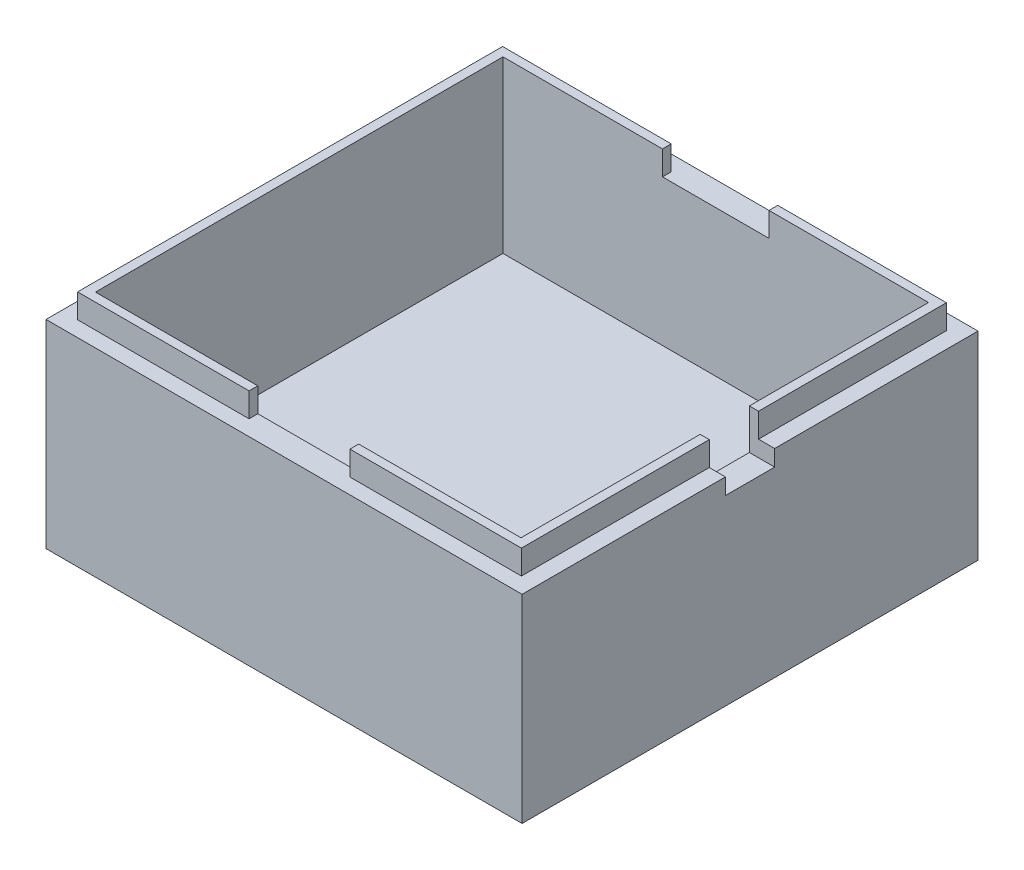
ISO-10303-21;
HEADER;
FILE_DESCRIPTION(('STEP AP214'),'2;1');
FILE_NAME('part.step','',(''),(''),'','','');
FILE_SCHEMA(('AUTOMOTIVE_DESIGN { 1 0 10303 214 1 1 1 1 }'));
ENDSEC;
DATA;
#1=APPLICATION_CONTEXT('core data for automotive mechanical design processes');
#2=APPLICATION_PROTOCOL_DEFINITION('international standard','automotive_design',2000,#1);
#3=PRODUCT_CONTEXT('',#1,'mechanical');
#4=PRODUCT('Part','Part','',(#3));
#5=PRODUCT_RELATED_PRODUCT_CATEGORY('part','',(#4));
#6=PRODUCT_DEFINITION_FORMATION('','',#4);
#7=PRODUCT_DEFINITION_CONTEXT('part definition',#1,'design');
#8=PRODUCT_DEFINITION('design','',#6,#7);
#9=PRODUCT_DEFINITION_SHAPE('','',#8);
#10=(LENGTH_UNIT() NAMED_UNIT(*) SI_UNIT(.MILLI.,.METRE.));
#11=(NAMED_UNIT(*) PLANE_ANGLE_UNIT() SI_UNIT($,.RADIAN.));
#12=(NAMED_UNIT(*) SI_UNIT($,.STERADIAN.) SOLID_ANGLE_UNIT());
#13=UNCERTAINTY_MEASURE_WITH_UNIT(LENGTH_MEASURE(1.E-05),#10,'distance_accuracy_value','');
#14=(GEOMETRIC_REPRESENTATION_CONTEXT(3) GLOBAL_UNCERTAINTY_ASSIGNED_CONTEXT((#13)) GLOBAL_UNIT_ASSIGNED_CONTEXT((#10,
#11,#12)) REPRESENTATION_CONTEXT('',''));
#15=CARTESIAN_POINT('',(0.,0.,0.));
#16=DIRECTION('',(0.,0.,1.));
#17=DIRECTION('',(1.,0.,0.));
#18=AXIS2_PLACEMENT_3D('',#15,#16,#17);
#19=CARTESIAN_POINT('',(-22.9999999999999,10.,21.7500000000002));
#20=DIRECTION('',(0.,-1.,0.));
#21=DIRECTION('',(0.,0.,-1.));
#22=AXIS2_PLACEMENT_3D('',#19,#20,#21);
#23=CYLINDRICAL_SURFACE('',#22,1.8526);
#24=CARTESIAN_POINT('',(-22.9999999999999,6.5,21.7500000000002));
#25=DIRECTION('',(0.,-1.,0.));
#26=DIRECTION('',(0.,0.,-1.));
#27=AXIS2_PLACEMENT_3D('',#24,#25,#26);
#28=CIRCLE('',#27,1.8526);
#29=CARTESIAN_POINT('',(-22.9999999999999,6.5,19.8974000000002));
#30=VERTEX_POINT('',#29);
#31=EDGE_CURVE('E478',#30,#30,#28,.T.);
#32=ORIENTED_EDGE('',*,*,#31,.F.);
#33=EDGE_LOOP('',(#32));
#34=FACE_BOUND('',#33,.T.);
#35=CARTESIAN_POINT('',(-22.9999999999999,4.5,21.7500000000002));
#36=DIRECTION('',(0.,-1.,0.));
#37=DIRECTION('',(0.,0.,-1.));
#38=AXIS2_PLACEMENT_3D('',#35,#36,#37);
#39=CIRCLE('',#38,1.8526);
#40=CARTESIAN_POINT('',(-22.9999999999999,4.5,19.8974000000002));
#41=VERTEX_POINT('',#40);
#42=EDGE_CURVE('E43',#41,#41,#39,.F.);
#43=ORIENTED_EDGE('',*,*,#42,.F.);
#44=EDGE_LOOP('',(#43));
#45=FACE_BOUND('',#44,.T.);
#46=ADVANCED_FACE('F39',(#34,#45),#23,.F.);
#47=CARTESIAN_POINT('',(23.,10.,-21.75));
#48=DIRECTION('',(0.,-1.,0.));
#49=DIRECTION('',(0.,0.,-1.));
#50=AXIS2_PLACEMENT_3D('',#47,#48,#49);
#51=CYLINDRICAL_SURFACE('',#50,1.8526);
#52=CARTESIAN_POINT('',(23.,6.5,-21.75));
#53=DIRECTION('',(0.,-1.,0.));
#54=DIRECTION('',(0.,0.,-1.));
#55=AXIS2_PLACEMENT_3D('',#52,#53,#54);
#56=CIRCLE('',#55,1.8526);
#57=CARTESIAN_POINT('',(23.,6.5,-23.6026));
#58=VERTEX_POINT('',#57);
#59=EDGE_CURVE('E251',#58,#58,#56,.T.);
#60=ORIENTED_EDGE('',*,*,#59,.F.);
#61=EDGE_LOOP('',(#60));
#62=FACE_BOUND('',#61,.T.);
#63=CARTESIAN_POINT('',(23.,4.5,-21.75));
#64=DIRECTION('',(0.,-1.,0.));
#65=DIRECTION('',(0.,0.,-1.));
#66=AXIS2_PLACEMENT_3D('',#63,#64,#65);
#67=CIRCLE('',#66,1.8526);
#68=CARTESIAN_POINT('',(23.,4.5,-23.6026));
#69=VERTEX_POINT('',#68);
#70=EDGE_CURVE('E469',#69,#69,#67,.F.);
#71=ORIENTED_EDGE('',*,*,#70,.F.);
#72=EDGE_LOOP('',(#71));
#73=FACE_BOUND('',#72,.T.);
#74=ADVANCED_FACE('F505',(#62,#73),#51,.F.);
#75=CARTESIAN_POINT('',(0.,27.6,0.));
#76=DIRECTION('',(0.,-1.,0.));
#77=DIRECTION('',(0.,0.,-1.));
#78=AXIS2_PLACEMENT_3D('',#75,#76,#77);
#79=PLANE('',#78);
#80=DIRECTION('',(1.,0.,0.));
#81=VECTOR('',#80,1.);
#82=CARTESIAN_POINT('',(-26.3672566371681,27.6,25.25));
#83=LINE('',#82,#81);
#84=CARTESIAN_POINT('',(6.25,27.6,25.25));
#85=VERTEX_POINT('',#84);
#86=CARTESIAN_POINT('',(26.3672566371681,27.6,25.25));
#87=VERTEX_POINT('',#86);
#88=EDGE_CURVE('E401',#85,#87,#83,.T.);
#89=ORIENTED_EDGE('',*,*,#88,.F.);
#90=DIRECTION('',(0.,0.,-1.));
#91=VECTOR('',#90,1.);
#92=CARTESIAN_POINT('',(6.25,27.6,27.4194915254237));
#93=LINE('',#92,#91);
#94=CARTESIAN_POINT('',(6.25,27.6,26.3347457627119));
#95=VERTEX_POINT('',#94);
#96=EDGE_CURVE('E276',#95,#85,#93,.T.);
#97=ORIENTED_EDGE('',*,*,#96,.F.);
#98=DIRECTION('',(1.,0.,0.));
#99=VECTOR('',#98,1.);
#100=CARTESIAN_POINT('',(-27.5,27.6,26.3347457627119));
#101=LINE('',#100,#99);
#102=CARTESIAN_POINT('',(27.5,27.6,26.3347457627119));
#103=VERTEX_POINT('',#102);
#104=EDGE_CURVE('E355',#95,#103,#101,.T.);
#105=ORIENTED_EDGE('',*,*,#104,.T.);
#106=DIRECTION('',(0.,0.,-1.));
#107=VECTOR('',#106,1.);
#108=CARTESIAN_POINT('',(27.5,27.6,26.3347457627119));
#109=LINE('',#108,#107);
#110=CARTESIAN_POINT('',(27.5,27.6,3.05));
#111=VERTEX_POINT('',#110);
#112=EDGE_CURVE('E342',#103,#111,#109,.T.);
#113=ORIENTED_EDGE('',*,*,#112,.T.);
#114=DIRECTION('',(1.,0.,0.));
#115=VECTOR('',#114,1.);
#116=CARTESIAN_POINT('',(25.2345132743363,27.6,3.05));
#117=LINE('',#116,#115);
#118=CARTESIAN_POINT('',(26.3672566371681,27.6,3.05));
#119=VERTEX_POINT('',#118);
#120=EDGE_CURVE('E303',#119,#111,#117,.T.);
#121=ORIENTED_EDGE('',*,*,#120,.F.);
#122=DIRECTION('',(0.,0.,-1.));
#123=VECTOR('',#122,1.);
#124=CARTESIAN_POINT('',(26.3672566371681,27.6,25.25));
#125=LINE('',#124,#123);
#126=EDGE_CURVE('E223',#87,#119,#125,.T.);
#127=ORIENTED_EDGE('',*,*,#126,.F.);
#128=EDGE_LOOP('',(#89,#97,#105,#113,#121,#127));
#129=FACE_BOUND('',#128,.T.);
#130=ADVANCED_FACE('F508',(#129),#79,.F.);
#131=DIRECTION('',(-1.,0.,0.));
#132=VECTOR('',#131,1.);
#133=CARTESIAN_POINT('',(-27.5,27.6,-26.3347457627119));
#134=LINE('',#133,#132);
#135=CARTESIAN_POINT('',(27.5,27.6,-26.3347457627119));
#136=VERTEX_POINT('',#135);
#137=CARTESIAN_POINT('',(6.59999999999999,27.6,-26.3347457627119));
#138=VERTEX_POINT('',#137);
#139=EDGE_CURVE('E347',#136,#138,#134,.T.);
#140=ORIENTED_EDGE('',*,*,#139,.T.);
#141=DIRECTION('',(0.,0.,-1.));
#142=VECTOR('',#141,1.);
#143=CARTESIAN_POINT('',(6.59999999999999,27.6,-24.4194915254237));
#144=LINE('',#143,#142);
#145=CARTESIAN_POINT('',(6.59999999999999,27.6,-25.25));
#146=VERTEX_POINT('',#145);
#147=EDGE_CURVE('E295',#146,#138,#144,.T.);
#148=ORIENTED_EDGE('',*,*,#147,.F.);
#149=DIRECTION('',(-1.,0.,0.));
#150=VECTOR('',#149,1.);
#151=CARTESIAN_POINT('',(-26.3672566371681,27.6,-25.25));
#152=LINE('',#151,#150);
#153=CARTESIAN_POINT('',(26.3672566371681,27.6,-25.25));
#154=VERTEX_POINT('',#153);
#155=EDGE_CURVE('E393',#154,#146,#152,.T.);
#156=ORIENTED_EDGE('',*,*,#155,.F.);
#157=CARTESIAN_POINT('',(26.3672566371681,27.6,-3.05));
#158=VERTEX_POINT('',#157);
#159=EDGE_CURVE('E392',#158,#154,#125,.T.);
#160=ORIENTED_EDGE('',*,*,#159,.F.);
#161=DIRECTION('',(-1.,0.,0.));
#162=VECTOR('',#161,1.);
#163=CARTESIAN_POINT('',(25.2345132743363,27.6,-3.05));
#164=LINE('',#163,#162);
#165=CARTESIAN_POINT('',(27.5,27.6,-3.05));
#166=VERTEX_POINT('',#165);
#167=EDGE_CURVE('E263',#166,#158,#164,.T.);
#168=ORIENTED_EDGE('',*,*,#167,.F.);
#169=EDGE_CURVE('E227',#166,#136,#109,.T.);
#170=ORIENTED_EDGE('',*,*,#169,.T.);
#171=EDGE_LOOP('',(#140,#148,#156,#160,#168,#170));
#172=FACE_BOUND('',#171,.T.);
#173=ADVANCED_FACE('F514',(#172),#79,.F.);
#174=CARTESIAN_POINT('',(27.5,24.6,26.3347457627119));
#175=DIRECTION('',(1.,0.,0.));
#176=DIRECTION('',(0.,0.,-1.));
#177=AXIS2_PLACEMENT_3D('',#174,#175,#176);
#178=PLANE('',#177);
#179=DIRECTION('',(0.,1.,0.));
#180=VECTOR('',#179,1.);
#181=CARTESIAN_POINT('',(27.5,24.6,3.05));
#182=LINE('',#181,#180);
#183=CARTESIAN_POINT('',(27.5,24.6,3.05));
#184=VERTEX_POINT('',#183);
#185=EDGE_CURVE('E298',#184,#111,#182,.T.);
#186=ORIENTED_EDGE('',*,*,#185,.T.);
#187=ORIENTED_EDGE('',*,*,#112,.F.);
#188=DIRECTION('',(0.,1.,0.));
#189=VECTOR('',#188,1.);
#190=CARTESIAN_POINT('',(27.5,24.6,26.3347457627119));
#191=LINE('',#190,#189);
#192=CARTESIAN_POINT('',(27.5,24.6,26.3347457627119));
#193=VERTEX_POINT('',#192);
#194=EDGE_CURVE('E360',#193,#103,#191,.T.);
#195=ORIENTED_EDGE('',*,*,#194,.F.);
#196=DIRECTION('',(0.,0.,-1.));
#197=VECTOR('',#196,1.);
#198=CARTESIAN_POINT('',(27.5,24.6,26.3347457627119));
#199=LINE('',#198,#197);
#200=EDGE_CURVE('E322',#193,#184,#199,.T.);
#201=ORIENTED_EDGE('',*,*,#200,.T.);
#202=EDGE_LOOP('',(#186,#187,#195,#201));
#203=FACE_BOUND('',#202,.T.);
#204=ADVANCED_FACE('F569',(#203),#178,.T.);
#205=CARTESIAN_POINT('',(-27.5,24.6,26.3347457627119));
#206=DIRECTION('',(0.,0.,1.));
#207=DIRECTION('',(1.,0.,0.));
#208=AXIS2_PLACEMENT_3D('',#205,#206,#207);
#209=PLANE('',#208);
#210=DIRECTION('',(0.,1.,0.));
#211=VECTOR('',#210,1.);
#212=CARTESIAN_POINT('',(6.25,24.6,26.3347457627119));
#213=LINE('',#212,#211);
#214=CARTESIAN_POINT('',(6.25,24.6,26.3347457627119));
#215=VERTEX_POINT('',#214);
#216=EDGE_CURVE('E11',#215,#95,#213,.T.);
#217=ORIENTED_EDGE('',*,*,#216,.F.);
#218=DIRECTION('',(1.,0.,0.));
#219=VECTOR('',#218,1.);
#220=CARTESIAN_POINT('',(-27.5,24.6,26.3347457627119));
#221=LINE('',#220,#219);
#222=EDGE_CURVE('E336',#215,#193,#221,.T.);
#223=ORIENTED_EDGE('',*,*,#222,.T.);
#224=ORIENTED_EDGE('',*,*,#194,.T.);
#225=ORIENTED_EDGE('',*,*,#104,.F.);
#226=EDGE_LOOP('',(#217,#223,#224,#225));
#227=FACE_BOUND('',#226,.T.);
#228=ADVANCED_FACE('F555',(#227),#209,.T.);
#229=CARTESIAN_POINT('',(-27.5,24.6,-26.3347457627119));
#230=DIRECTION('',(0.,0.,-1.));
#231=DIRECTION('',(-1.,0.,0.));
#232=AXIS2_PLACEMENT_3D('',#229,#230,#231);
#233=PLANE('',#232);
#234=DIRECTION('',(0.,-1.,0.));
#235=VECTOR('',#234,1.);
#236=CARTESIAN_POINT('',(6.59999999999999,24.6,-26.3347457627119));
#237=LINE('',#236,#235);
#238=CARTESIAN_POINT('',(6.59999999999999,24.6,-26.3347457627119));
#239=VERTEX_POINT('',#238);
#240=EDGE_CURVE('E465',#138,#239,#237,.T.);
#241=ORIENTED_EDGE('',*,*,#240,.F.);
#242=ORIENTED_EDGE('',*,*,#139,.F.);
#243=DIRECTION('',(0.,1.,0.));
#244=VECTOR('',#243,1.);
#245=CARTESIAN_POINT('',(27.5,24.6,-26.3347457627119));
#246=LINE('',#245,#244);
#247=CARTESIAN_POINT('',(27.5,24.6,-26.3347457627119));
#248=VERTEX_POINT('',#247);
#249=EDGE_CURVE('E341',#248,#136,#246,.T.);
#250=ORIENTED_EDGE('',*,*,#249,.F.);
#251=DIRECTION('',(-1.,0.,0.));
#252=VECTOR('',#251,1.);
#253=CARTESIAN_POINT('',(-27.5,24.6,-26.3347457627119));
#254=LINE('',#253,#252);
#255=EDGE_CURVE('E328',#248,#239,#254,.T.);
#256=ORIENTED_EDGE('',*,*,#255,.T.);
#257=EDGE_LOOP('',(#241,#242,#250,#256));
#258=FACE_BOUND('',#257,.T.);
#259=ADVANCED_FACE('F564',(#258),#233,.T.);
#260=CARTESIAN_POINT('',(-27.5,27.6,26.3347457627119));
#261=VERTEX_POINT('',#260);
#262=CARTESIAN_POINT('',(-6.25,27.6,26.3347457627119));
#263=VERTEX_POINT('',#262);
#264=EDGE_CURVE('E356',#261,#263,#101,.T.);
#265=ORIENTED_EDGE('',*,*,#264,.T.);
#266=DIRECTION('',(0.,0.,1.));
#267=VECTOR('',#266,1.);
#268=CARTESIAN_POINT('',(-6.25,27.6,27.4194915254237));
#269=LINE('',#268,#267);
#270=CARTESIAN_POINT('',(-6.25,27.6,25.25));
#271=VERTEX_POINT('',#270);
#272=EDGE_CURVE('E270',#271,#263,#269,.T.);
#273=ORIENTED_EDGE('',*,*,#272,.F.);
#274=CARTESIAN_POINT('',(-26.3672566371681,27.6,25.25));
#275=VERTEX_POINT('',#274);
#276=EDGE_CURVE('E402',#275,#271,#83,.T.);
#277=ORIENTED_EDGE('',*,*,#276,.F.);
#278=DIRECTION('',(0.,0.,1.));
#279=VECTOR('',#278,1.);
#280=CARTESIAN_POINT('',(-26.3672566371681,27.6,25.25));
#281=LINE('',#280,#279);
#282=CARTESIAN_POINT('',(-26.3672566371681,27.6,-25.25));
#283=VERTEX_POINT('',#282);
#284=EDGE_CURVE('E397',#283,#275,#281,.T.);
#285=ORIENTED_EDGE('',*,*,#284,.F.);
#286=CARTESIAN_POINT('',(-6.60000000000001,27.6,-25.25));
#287=VERTEX_POINT('',#286);
#288=EDGE_CURVE('E391',#287,#283,#152,.T.);
#289=ORIENTED_EDGE('',*,*,#288,.F.);
#290=DIRECTION('',(0.,0.,1.));
#291=VECTOR('',#290,1.);
#292=CARTESIAN_POINT('',(-6.60000000000001,27.6,-24.4194915254237));
#293=LINE('',#292,#291);
#294=CARTESIAN_POINT('',(-6.60000000000001,27.6,-26.3347457627119));
#295=VERTEX_POINT('',#294);
#296=EDGE_CURVE('E291',#295,#287,#293,.T.);
#297=ORIENTED_EDGE('',*,*,#296,.F.);
#298=CARTESIAN_POINT('',(-27.5,27.6,-26.3347457627119));
#299=VERTEX_POINT('',#298);
#300=EDGE_CURVE('E346',#295,#299,#134,.T.);
#301=ORIENTED_EDGE('',*,*,#300,.T.);
#302=DIRECTION('',(0.,0.,1.));
#303=VECTOR('',#302,1.);
#304=CARTESIAN_POINT('',(-27.5,27.6,26.3347457627119));
#305=LINE('',#304,#303);
#306=EDGE_CURVE('E351',#299,#261,#305,.T.);
#307=ORIENTED_EDGE('',*,*,#306,.T.);
#308=EDGE_LOOP('',(#265,#273,#277,#285,#289,#297,#301,#307));
#309=FACE_BOUND('',#308,.T.);
#310=ADVANCED_FACE('F517',(#309),#79,.F.);
#311=CARTESIAN_POINT('',(26.3672566371681,27.6,25.25));
#312=DIRECTION('',(-1.,0.,0.));
#313=DIRECTION('',(0.,0.,1.));
#314=AXIS2_PLACEMENT_3D('',#311,#312,#313);
#315=PLANE('',#314);
#316=DIRECTION('',(0.,0.,1.));
#317=VECTOR('',#316,1.);
#318=CARTESIAN_POINT('',(26.3672566371681,22.6,3.05));
#319=LINE('',#318,#317);
#320=CARTESIAN_POINT('',(26.3672566371681,22.6,-3.05));
#321=VERTEX_POINT('',#320);
#322=CARTESIAN_POINT('',(26.3672566371681,22.6,3.05));
#323=VERTEX_POINT('',#322);
#324=EDGE_CURVE('E220',#321,#323,#319,.T.);
#325=ORIENTED_EDGE('',*,*,#324,.F.);
#326=DIRECTION('',(0.,-1.,0.));
#327=VECTOR('',#326,1.);
#328=CARTESIAN_POINT('',(26.3672566371681,27.6,-3.05));
#329=LINE('',#328,#327);
#330=EDGE_CURVE('E228',#158,#321,#329,.T.);
#331=ORIENTED_EDGE('',*,*,#330,.F.);
#332=ORIENTED_EDGE('',*,*,#159,.T.);
#333=DIRECTION('',(0.,-1.,0.));
#334=VECTOR('',#333,1.);
#335=CARTESIAN_POINT('',(26.3672566371681,27.6,-25.25));
#336=LINE('',#335,#334);
#337=CARTESIAN_POINT('',(26.3672566371681,6.5,-25.25));
#338=VERTEX_POINT('',#337);
#339=EDGE_CURVE('E430',#154,#338,#336,.T.);
#340=ORIENTED_EDGE('',*,*,#339,.T.);
#341=DIRECTION('',(0.,0.,-1.));
#342=VECTOR('',#341,1.);
#343=CARTESIAN_POINT('',(26.3672566371681,6.5,25.25));
#344=LINE('',#343,#342);
#345=CARTESIAN_POINT('',(26.3672566371681,6.5,25.25));
#346=VERTEX_POINT('',#345);
#347=EDGE_CURVE('E388',#346,#338,#344,.T.);
#348=ORIENTED_EDGE('',*,*,#347,.F.);
#349=DIRECTION('',(0.,-1.,0.));
#350=VECTOR('',#349,1.);
#351=CARTESIAN_POINT('',(26.3672566371681,27.6,25.25));
#352=LINE('',#351,#350);
#353=EDGE_CURVE('E406',#87,#346,#352,.T.);
#354=ORIENTED_EDGE('',*,*,#353,.F.);
#355=ORIENTED_EDGE('',*,*,#126,.T.);
#356=DIRECTION('',(0.,1.,0.));
#357=VECTOR('',#356,1.);
#358=CARTESIAN_POINT('',(26.3672566371681,27.6,3.05));
#359=LINE('',#358,#357);
#360=EDGE_CURVE('E215',#323,#119,#359,.T.);
#361=ORIENTED_EDGE('',*,*,#360,.F.);
#362=EDGE_LOOP('',(#325,#331,#332,#340,#348,#354,#355,#361));
#363=FACE_BOUND('',#362,.T.);
#364=ADVANCED_FACE('F217',(#363),#315,.T.);
#365=CARTESIAN_POINT('',(-26.3672566371681,27.6,-25.25));
#366=DIRECTION('',(0.,0.,1.));
#367=DIRECTION('',(1.,0.,0.));
#368=AXIS2_PLACEMENT_3D('',#365,#366,#367);
#369=PLANE('',#368);
#370=DIRECTION('',(0.,1.,0.));
#371=VECTOR('',#370,1.);
#372=CARTESIAN_POINT('',(6.59999999999999,27.6,-25.25));
#373=LINE('',#372,#371);
#374=CARTESIAN_POINT('',(6.59999999999999,24.6,-25.25));
#375=VERTEX_POINT('',#374);
#376=EDGE_CURVE('E317',#375,#146,#373,.T.);
#377=ORIENTED_EDGE('',*,*,#376,.F.);
#378=DIRECTION('',(1.,0.,0.));
#379=VECTOR('',#378,1.);
#380=CARTESIAN_POINT('',(-26.3672566371681,24.6,-25.25));
#381=LINE('',#380,#379);
#382=CARTESIAN_POINT('',(-6.60000000000001,24.6,-25.25));
#383=VERTEX_POINT('',#382);
#384=EDGE_CURVE('E285',#383,#375,#381,.T.);
#385=ORIENTED_EDGE('',*,*,#384,.F.);
#386=DIRECTION('',(0.,-1.,0.));
#387=VECTOR('',#386,1.);
#388=CARTESIAN_POINT('',(-6.60000000000001,27.6,-25.25));
#389=LINE('',#388,#387);
#390=EDGE_CURVE('E314',#287,#383,#389,.T.);
#391=ORIENTED_EDGE('',*,*,#390,.F.);
#392=ORIENTED_EDGE('',*,*,#288,.T.);
#393=DIRECTION('',(0.,-1.,0.));
#394=VECTOR('',#393,1.);
#395=CARTESIAN_POINT('',(-26.3672566371681,27.6,-25.25));
#396=LINE('',#395,#394);
#397=CARTESIAN_POINT('',(-26.3672566371681,6.5,-25.25));
#398=VERTEX_POINT('',#397);
#399=EDGE_CURVE('E427',#283,#398,#396,.T.);
#400=ORIENTED_EDGE('',*,*,#399,.T.);
#401=DIRECTION('',(-1.,0.,0.));
#402=VECTOR('',#401,1.);
#403=CARTESIAN_POINT('',(-26.3672566371681,6.5,-25.25));
#404=LINE('',#403,#402);
#405=EDGE_CURVE('E410',#338,#398,#404,.T.);
#406=ORIENTED_EDGE('',*,*,#405,.F.);
#407=ORIENTED_EDGE('',*,*,#339,.F.);
#408=ORIENTED_EDGE('',*,*,#155,.T.);
#409=EDGE_LOOP('',(#377,#385,#391,#392,#400,#406,#407,#408));
#410=FACE_BOUND('',#409,.T.);
#411=ADVANCED_FACE('F579',(#410),#369,.T.);
#412=CARTESIAN_POINT('',(-26.3672566371681,27.6,25.25));
#413=DIRECTION('',(1.,0.,0.));
#414=DIRECTION('',(0.,0.,-1.));
#415=AXIS2_PLACEMENT_3D('',#412,#413,#414);
#416=PLANE('',#415);
#417=DIRECTION('',(0.,0.,1.));
#418=VECTOR('',#417,1.);
#419=CARTESIAN_POINT('',(-26.3672566371681,6.5,25.25));
#420=LINE('',#419,#418);
#421=CARTESIAN_POINT('',(-26.3672566371681,6.5,25.25));
#422=VERTEX_POINT('',#421);
#423=EDGE_CURVE('E414',#398,#422,#420,.T.);
#424=ORIENTED_EDGE('',*,*,#423,.F.);
#425=ORIENTED_EDGE('',*,*,#399,.F.);
#426=ORIENTED_EDGE('',*,*,#284,.T.);
#427=DIRECTION('',(0.,-1.,0.));
#428=VECTOR('',#427,1.);
#429=CARTESIAN_POINT('',(-26.3672566371681,27.6,25.25));
#430=LINE('',#429,#428);
#431=EDGE_CURVE('E424',#275,#422,#430,.T.);
#432=ORIENTED_EDGE('',*,*,#431,.T.);
#433=EDGE_LOOP('',(#424,#425,#426,#432));
#434=FACE_BOUND('',#433,.T.);
#435=ADVANCED_FACE('F575',(#434),#416,.T.);
#436=CARTESIAN_POINT('',(-26.3672566371681,27.6,25.25));
#437=DIRECTION('',(0.,0.,-1.));
#438=DIRECTION('',(-1.,0.,0.));
#439=AXIS2_PLACEMENT_3D('',#436,#437,#438);
#440=PLANE('',#439);
#441=DIRECTION('',(0.,1.,0.));
#442=VECTOR('',#441,1.);
#443=CARTESIAN_POINT('',(6.25,24.6,25.25));
#444=LINE('',#443,#442);
#445=CARTESIAN_POINT('',(6.25,24.6,25.25));
#446=VERTEX_POINT('',#445);
#447=EDGE_CURVE('E275',#446,#85,#444,.T.);
#448=ORIENTED_EDGE('',*,*,#447,.T.);
#449=ORIENTED_EDGE('',*,*,#88,.T.);
#450=ORIENTED_EDGE('',*,*,#353,.T.);
#451=DIRECTION('',(1.,0.,0.));
#452=VECTOR('',#451,1.);
#453=CARTESIAN_POINT('',(-26.3672566371681,6.5,25.25));
#454=LINE('',#453,#452);
#455=EDGE_CURVE('E418',#422,#346,#454,.T.);
#456=ORIENTED_EDGE('',*,*,#455,.F.);
#457=ORIENTED_EDGE('',*,*,#431,.F.);
#458=ORIENTED_EDGE('',*,*,#276,.T.);
#459=DIRECTION('',(0.,1.,0.));
#460=VECTOR('',#459,1.);
#461=CARTESIAN_POINT('',(-6.25,24.6,25.25));
#462=LINE('',#461,#460);
#463=CARTESIAN_POINT('',(-6.25,24.6,25.25));
#464=VERTEX_POINT('',#463);
#465=EDGE_CURVE('E282',#464,#271,#462,.T.);
#466=ORIENTED_EDGE('',*,*,#465,.F.);
#467=DIRECTION('',(-1.,0.,0.));
#468=VECTOR('',#467,1.);
#469=CARTESIAN_POINT('',(-6.25,24.6,25.25));
#470=LINE('',#469,#468);
#471=EDGE_CURVE('E269',#446,#464,#470,.T.);
#472=ORIENTED_EDGE('',*,*,#471,.F.);
#473=EDGE_LOOP('',(#448,#449,#450,#456,#457,#458,#466,#472));
#474=FACE_BOUND('',#473,.T.);
#475=ADVANCED_FACE('F572',(#474),#440,.T.);
#476=CARTESIAN_POINT('',(0.,6.5,0.));
#477=DIRECTION('',(0.,-1.,0.));
#478=DIRECTION('',(0.,0.,-1.));
#479=AXIS2_PLACEMENT_3D('',#476,#477,#478);
#480=PLANE('',#479);
#481=ORIENTED_EDGE('',*,*,#59,.T.);
#482=EDGE_LOOP('',(#481));
#483=FACE_BOUND('',#482,.T.);
#484=ORIENTED_EDGE('',*,*,#31,.T.);
#485=EDGE_LOOP('',(#484));
#486=FACE_BOUND('',#485,.T.);
#487=ORIENTED_EDGE('',*,*,#455,.T.);
#488=ORIENTED_EDGE('',*,*,#347,.T.);
#489=ORIENTED_EDGE('',*,*,#405,.T.);
#490=ORIENTED_EDGE('',*,*,#423,.T.);
#491=EDGE_LOOP('',(#487,#488,#489,#490));
#492=FACE_BOUND('',#491,.T.);
#493=ADVANCED_FACE('F503',(#483,#486,#492),#480,.F.);
#494=CARTESIAN_POINT('',(0.,24.6,0.));
#495=DIRECTION('',(0.,-1.,0.));
#496=DIRECTION('',(0.,0.,-1.));
#497=AXIS2_PLACEMENT_3D('',#494,#495,#496);
#498=PLANE('',#497);
#499=CARTESIAN_POINT('',(27.5,24.6,-3.05));
#500=VERTEX_POINT('',#499);
#501=EDGE_CURVE('E327',#500,#248,#199,.T.);
#502=ORIENTED_EDGE('',*,*,#501,.F.);
#503=DIRECTION('',(-1.,0.,0.));
#504=VECTOR('',#503,1.);
#505=CARTESIAN_POINT('',(26.3672566371681,24.6,-3.05));
#506=LINE('',#505,#504);
#507=CARTESIAN_POINT('',(29.5,24.6,-3.05));
#508=VERTEX_POINT('',#507);
#509=EDGE_CURVE('E245',#508,#500,#506,.T.);
#510=ORIENTED_EDGE('',*,*,#509,.F.);
#511=DIRECTION('',(0.,0.,-1.));
#512=VECTOR('',#511,1.);
#513=CARTESIAN_POINT('',(29.5,24.6,28.25));
#514=LINE('',#513,#512);
#515=CARTESIAN_POINT('',(29.5,24.6,-28.25));
#516=VERTEX_POINT('',#515);
#517=EDGE_CURVE('E364',#508,#516,#514,.T.);
#518=ORIENTED_EDGE('',*,*,#517,.T.);
#519=DIRECTION('',(-1.,0.,0.));
#520=VECTOR('',#519,1.);
#521=CARTESIAN_POINT('',(-29.5,24.6,-28.25));
#522=LINE('',#521,#520);
#523=CARTESIAN_POINT('',(-29.5,24.6,-28.25));
#524=VERTEX_POINT('',#523);
#525=EDGE_CURVE('E379',#516,#524,#522,.T.);
#526=ORIENTED_EDGE('',*,*,#525,.T.);
#527=DIRECTION('',(0.,0.,1.));
#528=VECTOR('',#527,1.);
#529=CARTESIAN_POINT('',(-29.5,24.6,28.25));
#530=LINE('',#529,#528);
#531=CARTESIAN_POINT('',(-29.5,24.6,28.25));
#532=VERTEX_POINT('',#531);
#533=EDGE_CURVE('E382',#524,#532,#530,.T.);
#534=ORIENTED_EDGE('',*,*,#533,.T.);
#535=DIRECTION('',(1.,0.,0.));
#536=VECTOR('',#535,1.);
#537=CARTESIAN_POINT('',(-29.5,24.6,28.25));
#538=LINE('',#537,#536);
#539=CARTESIAN_POINT('',(29.5,24.6,28.25));
#540=VERTEX_POINT('',#539);
#541=EDGE_CURVE('E385',#532,#540,#538,.T.);
#542=ORIENTED_EDGE('',*,*,#541,.T.);
#543=CARTESIAN_POINT('',(29.5,24.6,3.05));
#544=VERTEX_POINT('',#543);
#545=EDGE_CURVE('E375',#540,#544,#514,.T.);
#546=ORIENTED_EDGE('',*,*,#545,.T.);
#547=DIRECTION('',(1.,0.,0.));
#548=VECTOR('',#547,1.);
#549=CARTESIAN_POINT('',(26.3672566371681,24.6,3.05));
#550=LINE('',#549,#548);
#551=EDGE_CURVE('E248',#184,#544,#550,.T.);
#552=ORIENTED_EDGE('',*,*,#551,.F.);
#553=ORIENTED_EDGE('',*,*,#200,.F.);
#554=ORIENTED_EDGE('',*,*,#222,.F.);
#555=DIRECTION('',(0.,0.,-1.));
#556=VECTOR('',#555,1.);
#557=CARTESIAN_POINT('',(6.25,24.6,27.4194915254237));
#558=LINE('',#557,#556);
#559=EDGE_CURVE('E266',#215,#446,#558,.T.);
#560=ORIENTED_EDGE('',*,*,#559,.T.);
#561=ORIENTED_EDGE('',*,*,#471,.T.);
#562=DIRECTION('',(0.,0.,1.));
#563=VECTOR('',#562,1.);
#564=CARTESIAN_POINT('',(-6.25,24.6,27.4194915254237));
#565=LINE('',#564,#563);
#566=CARTESIAN_POINT('',(-6.25,24.6,26.3347457627119));
#567=VERTEX_POINT('',#566);
#568=EDGE_CURVE('E57',#464,#567,#565,.T.);
#569=ORIENTED_EDGE('',*,*,#568,.T.);
#570=CARTESIAN_POINT('',(-27.5,24.6,26.3347457627119));
#571=VERTEX_POINT('',#570);
#572=EDGE_CURVE('E337',#571,#567,#221,.T.);
#573=ORIENTED_EDGE('',*,*,#572,.F.);
#574=DIRECTION('',(0.,0.,1.));
#575=VECTOR('',#574,1.);
#576=CARTESIAN_POINT('',(-27.5,24.6,26.3347457627119));
#577=LINE('',#576,#575);
#578=CARTESIAN_POINT('',(-27.5,24.6,-26.3347457627119));
#579=VERTEX_POINT('',#578);
#580=EDGE_CURVE('E332',#579,#571,#577,.T.);
#581=ORIENTED_EDGE('',*,*,#580,.F.);
#582=CARTESIAN_POINT('',(-6.60000000000001,24.6,-26.3347457627119));
#583=VERTEX_POINT('',#582);
#584=EDGE_CURVE('E326',#583,#579,#254,.T.);
#585=ORIENTED_EDGE('',*,*,#584,.F.);
#586=DIRECTION('',(0.,0.,1.));
#587=VECTOR('',#586,1.);
#588=CARTESIAN_POINT('',(-6.60000000000001,24.6,-24.4194915254237));
#589=LINE('',#588,#587);
#590=EDGE_CURVE('E279',#583,#383,#589,.T.);
#591=ORIENTED_EDGE('',*,*,#590,.T.);
#592=ORIENTED_EDGE('',*,*,#384,.T.);
#593=DIRECTION('',(0.,0.,-1.));
#594=VECTOR('',#593,1.);
#595=CARTESIAN_POINT('',(6.59999999999999,24.6,-24.4194915254237));
#596=LINE('',#595,#594);
#597=EDGE_CURVE('E64',#375,#239,#596,.T.);
#598=ORIENTED_EDGE('',*,*,#597,.T.);
#599=ORIENTED_EDGE('',*,*,#255,.F.);
#600=EDGE_LOOP('',(#502,#510,#518,#526,#534,#542,#546,#552,#553,#554,#560,#561,#569,#573,#581,
#585,#591,#592,#598,#599));
#601=FACE_BOUND('',#600,.T.);
#602=ADVANCED_FACE('F567',(#601),#498,.F.);
#603=DIRECTION('',(0.,1.,0.));
#604=VECTOR('',#603,1.);
#605=CARTESIAN_POINT('',(27.5,24.6,-3.05));
#606=LINE('',#605,#604);
#607=EDGE_CURVE('E306',#500,#166,#606,.T.);
#608=ORIENTED_EDGE('',*,*,#607,.F.);
#609=ORIENTED_EDGE('',*,*,#501,.T.);
#610=ORIENTED_EDGE('',*,*,#249,.T.);
#611=ORIENTED_EDGE('',*,*,#169,.F.);
#612=EDGE_LOOP('',(#608,#609,#610,#611));
#613=FACE_BOUND('',#612,.T.);
#614=ADVANCED_FACE('F553',(#613),#178,.T.);
#615=DIRECTION('',(0.,-1.,0.));
#616=VECTOR('',#615,1.);
#617=CARTESIAN_POINT('',(-6.25,24.6,26.3347457627119));
#618=LINE('',#617,#616);
#619=EDGE_CURVE('E49',#263,#567,#618,.T.);
#620=ORIENTED_EDGE('',*,*,#619,.F.);
#621=ORIENTED_EDGE('',*,*,#264,.F.);
#622=DIRECTION('',(0.,1.,0.));
#623=VECTOR('',#622,1.);
#624=CARTESIAN_POINT('',(-27.5,24.6,26.3347457627119));
#625=LINE('',#624,#623);
#626=EDGE_CURVE('E365',#571,#261,#625,.T.);
#627=ORIENTED_EDGE('',*,*,#626,.F.);
#628=ORIENTED_EDGE('',*,*,#572,.T.);
#629=EDGE_LOOP('',(#620,#621,#627,#628));
#630=FACE_BOUND('',#629,.T.);
#631=ADVANCED_FACE('F549',(#630),#209,.T.);
#632=CARTESIAN_POINT('',(-27.5,24.6,26.3347457627119));
#633=DIRECTION('',(-1.,0.,0.));
#634=DIRECTION('',(0.,0.,1.));
#635=AXIS2_PLACEMENT_3D('',#632,#633,#634);
#636=PLANE('',#635);
#637=ORIENTED_EDGE('',*,*,#306,.F.);
#638=DIRECTION('',(0.,1.,0.));
#639=VECTOR('',#638,1.);
#640=CARTESIAN_POINT('',(-27.5,24.6,-26.3347457627119));
#641=LINE('',#640,#639);
#642=EDGE_CURVE('E368',#579,#299,#641,.T.);
#643=ORIENTED_EDGE('',*,*,#642,.F.);
#644=ORIENTED_EDGE('',*,*,#580,.T.);
#645=ORIENTED_EDGE('',*,*,#626,.T.);
#646=EDGE_LOOP('',(#637,#643,#644,#645));
#647=FACE_BOUND('',#646,.T.);
#648=ADVANCED_FACE('F552',(#647),#636,.T.);
#649=DIRECTION('',(0.,1.,0.));
#650=VECTOR('',#649,1.);
#651=CARTESIAN_POINT('',(-6.60000000000001,24.6,-26.3347457627119));
#652=LINE('',#651,#650);
#653=EDGE_CURVE('E462',#583,#295,#652,.T.);
#654=ORIENTED_EDGE('',*,*,#653,.F.);
#655=ORIENTED_EDGE('',*,*,#584,.T.);
#656=ORIENTED_EDGE('',*,*,#642,.T.);
#657=ORIENTED_EDGE('',*,*,#300,.F.);
#658=EDGE_LOOP('',(#654,#655,#656,#657));
#659=FACE_BOUND('',#658,.T.);
#660=ADVANCED_FACE('F558',(#659),#233,.T.);
#661=CARTESIAN_POINT('',(0.,0.,0.));
#662=DIRECTION('',(0.,-1.,0.));
#663=DIRECTION('',(0.,0.,-1.));
#664=AXIS2_PLACEMENT_3D('',#661,#662,#663);
#665=PLANE('',#664);
#666=CARTESIAN_POINT('',(-22.9999999999999,0.,21.7500000000002));
#667=DIRECTION('',(0.,-1.,0.));
#668=DIRECTION('',(0.,0.,-1.));
#669=AXIS2_PLACEMENT_3D('',#666,#667,#668);
#670=CIRCLE('',#669,4.50000000000017);
#671=CARTESIAN_POINT('',(-22.9999999999999,0.,17.2500000000001));
#672=VERTEX_POINT('',#671);
#673=EDGE_CURVE('E480',#672,#672,#670,.T.);
#674=ORIENTED_EDGE('',*,*,#673,.F.);
#675=EDGE_LOOP('',(#674));
#676=FACE_BOUND('',#675,.T.);
#677=CARTESIAN_POINT('',(23.,0.,-21.75));
#678=DIRECTION('',(0.,-1.,0.));
#679=DIRECTION('',(0.,0.,-1.));
#680=AXIS2_PLACEMENT_3D('',#677,#678,#679);
#681=CIRCLE('',#680,4.5);
#682=CARTESIAN_POINT('',(23.,0.,-26.25));
#683=VERTEX_POINT('',#682);
#684=EDGE_CURVE('E492',#683,#683,#681,.T.);
#685=ORIENTED_EDGE('',*,*,#684,.F.);
#686=EDGE_LOOP('',(#685));
#687=FACE_BOUND('',#686,.T.);
#688=DIRECTION('',(0.,0.,-1.));
#689=VECTOR('',#688,1.);
#690=CARTESIAN_POINT('',(29.5,0.,28.25));
#691=LINE('',#690,#689);
#692=CARTESIAN_POINT('',(29.5,0.,28.25));
#693=VERTEX_POINT('',#692);
#694=CARTESIAN_POINT('',(29.5,0.,-28.25));
#695=VERTEX_POINT('',#694);
#696=EDGE_CURVE('E434',#693,#695,#691,.T.);
#697=ORIENTED_EDGE('',*,*,#696,.F.);
#698=DIRECTION('',(1.,0.,0.));
#699=VECTOR('',#698,1.);
#700=CARTESIAN_POINT('',(-29.5,0.,28.25));
#701=LINE('',#700,#699);
#702=CARTESIAN_POINT('',(-29.5,0.,28.25));
#703=VERTEX_POINT('',#702);
#704=EDGE_CURVE('E446',#703,#693,#701,.T.);
#705=ORIENTED_EDGE('',*,*,#704,.F.);
#706=DIRECTION('',(0.,0.,1.));
#707=VECTOR('',#706,1.);
#708=CARTESIAN_POINT('',(-29.5,0.,28.25));
#709=LINE('',#708,#707);
#710=CARTESIAN_POINT('',(-29.5,0.,-28.25));
#711=VERTEX_POINT('',#710);
#712=EDGE_CURVE('E442',#711,#703,#709,.T.);
#713=ORIENTED_EDGE('',*,*,#712,.F.);
#714=DIRECTION('',(-1.,0.,0.));
#715=VECTOR('',#714,1.);
#716=CARTESIAN_POINT('',(-29.5,0.,-28.25));
#717=LINE('',#716,#715);
#718=EDGE_CURVE('E438',#695,#711,#717,.T.);
#719=ORIENTED_EDGE('',*,*,#718,.F.);
#720=EDGE_LOOP('',(#697,#705,#713,#719));
#721=FACE_BOUND('',#720,.T.);
#722=ADVANCED_FACE('F562',(#676,#687,#721),#665,.T.);
#723=CARTESIAN_POINT('',(-29.5,6.5,28.25));
#724=DIRECTION('',(0.,0.,-1.));
#725=DIRECTION('',(-1.,0.,0.));
#726=AXIS2_PLACEMENT_3D('',#723,#724,#725);
#727=PLANE('',#726);
#728=DIRECTION('',(0.,-1.,0.));
#729=VECTOR('',#728,1.);
#730=CARTESIAN_POINT('',(29.5,6.5,28.25));
#731=LINE('',#730,#729);
#732=EDGE_CURVE('E450',#540,#693,#731,.T.);
#733=ORIENTED_EDGE('',*,*,#732,.F.);
#734=ORIENTED_EDGE('',*,*,#541,.F.);
#735=DIRECTION('',(0.,-1.,0.));
#736=VECTOR('',#735,1.);
#737=CARTESIAN_POINT('',(-29.5,6.5,28.25));
#738=LINE('',#737,#736);
#739=EDGE_CURVE('E453',#532,#703,#738,.T.);
#740=ORIENTED_EDGE('',*,*,#739,.T.);
#741=ORIENTED_EDGE('',*,*,#704,.T.);
#742=EDGE_LOOP('',(#733,#734,#740,#741));
#743=FACE_BOUND('',#742,.T.);
#744=ADVANCED_FACE('F592',(#743),#727,.F.);
#745=CARTESIAN_POINT('',(-29.5,6.5,28.25));
#746=DIRECTION('',(1.,0.,0.));
#747=DIRECTION('',(0.,0.,-1.));
#748=AXIS2_PLACEMENT_3D('',#745,#746,#747);
#749=PLANE('',#748);
#750=ORIENTED_EDGE('',*,*,#739,.F.);
#751=ORIENTED_EDGE('',*,*,#533,.F.);
#752=DIRECTION('',(0.,-1.,0.));
#753=VECTOR('',#752,1.);
#754=CARTESIAN_POINT('',(-29.5,6.5,-28.25));
#755=LINE('',#754,#753);
#756=EDGE_CURVE('E456',#524,#711,#755,.T.);
#757=ORIENTED_EDGE('',*,*,#756,.T.);
#758=ORIENTED_EDGE('',*,*,#712,.T.);
#759=EDGE_LOOP('',(#750,#751,#757,#758));
#760=FACE_BOUND('',#759,.T.);
#761=ADVANCED_FACE('F596',(#760),#749,.F.);
#762=CARTESIAN_POINT('',(-29.5,6.5,-28.25));
#763=DIRECTION('',(0.,0.,1.));
#764=DIRECTION('',(1.,0.,0.));
#765=AXIS2_PLACEMENT_3D('',#762,#763,#764);
#766=PLANE('',#765);
#767=ORIENTED_EDGE('',*,*,#756,.F.);
#768=ORIENTED_EDGE('',*,*,#525,.F.);
#769=DIRECTION('',(0.,-1.,0.));
#770=VECTOR('',#769,1.);
#771=CARTESIAN_POINT('',(29.5,6.5,-28.25));
#772=LINE('',#771,#770);
#773=EDGE_CURVE('E459',#516,#695,#772,.T.);
#774=ORIENTED_EDGE('',*,*,#773,.T.);
#775=ORIENTED_EDGE('',*,*,#718,.T.);
#776=EDGE_LOOP('',(#767,#768,#774,#775));
#777=FACE_BOUND('',#776,.T.);
#778=ADVANCED_FACE('F599',(#777),#766,.F.);
#779=CARTESIAN_POINT('',(29.5,6.5,28.25));
#780=DIRECTION('',(-1.,0.,0.));
#781=DIRECTION('',(0.,0.,1.));
#782=AXIS2_PLACEMENT_3D('',#779,#780,#781);
#783=PLANE('',#782);
#784=ORIENTED_EDGE('',*,*,#517,.F.);
#785=DIRECTION('',(0.,1.,0.));
#786=VECTOR('',#785,1.);
#787=CARTESIAN_POINT('',(29.5,22.6,-3.05));
#788=LINE('',#787,#786);
#789=CARTESIAN_POINT('',(29.5,22.6,-3.05));
#790=VERTEX_POINT('',#789);
#791=EDGE_CURVE('E260',#790,#508,#788,.T.);
#792=ORIENTED_EDGE('',*,*,#791,.F.);
#793=DIRECTION('',(0.,0.,-1.));
#794=VECTOR('',#793,1.);
#795=CARTESIAN_POINT('',(29.5,22.6,3.05));
#796=LINE('',#795,#794);
#797=CARTESIAN_POINT('',(29.5,22.6,3.05));
#798=VERTEX_POINT('',#797);
#799=EDGE_CURVE('E238',#798,#790,#796,.T.);
#800=ORIENTED_EDGE('',*,*,#799,.F.);
#801=DIRECTION('',(0.,1.,0.));
#802=VECTOR('',#801,1.);
#803=CARTESIAN_POINT('',(29.5,22.6,3.05));
#804=LINE('',#803,#802);
#805=EDGE_CURVE('E234',#798,#544,#804,.T.);
#806=ORIENTED_EDGE('',*,*,#805,.T.);
#807=ORIENTED_EDGE('',*,*,#545,.F.);
#808=ORIENTED_EDGE('',*,*,#732,.T.);
#809=ORIENTED_EDGE('',*,*,#696,.T.);
#810=ORIENTED_EDGE('',*,*,#773,.F.);
#811=EDGE_LOOP('',(#784,#792,#800,#806,#807,#808,#809,#810));
#812=FACE_BOUND('',#811,.T.);
#813=ADVANCED_FACE('F41',(#812),#783,.F.);
#814=CARTESIAN_POINT('',(6.59999999999999,24.6,-24.4194915254237));
#815=DIRECTION('',(1.,0.,0.));
#816=DIRECTION('',(0.,0.,-1.));
#817=AXIS2_PLACEMENT_3D('',#814,#815,#816);
#818=PLANE('',#817);
#819=ORIENTED_EDGE('',*,*,#376,.T.);
#820=ORIENTED_EDGE('',*,*,#147,.T.);
#821=ORIENTED_EDGE('',*,*,#240,.T.);
#822=ORIENTED_EDGE('',*,*,#597,.F.);
#823=EDGE_LOOP('',(#819,#820,#821,#822));
#824=FACE_BOUND('',#823,.T.);
#825=ADVANCED_FACE('F539',(#824),#818,.F.);
#826=CARTESIAN_POINT('',(-6.60000000000001,24.6,-24.4194915254237));
#827=DIRECTION('',(-1.,0.,0.));
#828=DIRECTION('',(0.,0.,1.));
#829=AXIS2_PLACEMENT_3D('',#826,#827,#828);
#830=PLANE('',#829);
#831=ORIENTED_EDGE('',*,*,#390,.T.);
#832=ORIENTED_EDGE('',*,*,#590,.F.);
#833=ORIENTED_EDGE('',*,*,#653,.T.);
#834=ORIENTED_EDGE('',*,*,#296,.T.);
#835=EDGE_LOOP('',(#831,#832,#833,#834));
#836=FACE_BOUND('',#835,.T.);
#837=ADVANCED_FACE('F535',(#836),#830,.F.);
#838=CARTESIAN_POINT('',(6.25,24.6,27.4194915254237));
#839=DIRECTION('',(1.,0.,0.));
#840=DIRECTION('',(0.,0.,-1.));
#841=AXIS2_PLACEMENT_3D('',#838,#839,#840);
#842=PLANE('',#841);
#843=ORIENTED_EDGE('',*,*,#216,.T.);
#844=ORIENTED_EDGE('',*,*,#96,.T.);
#845=ORIENTED_EDGE('',*,*,#447,.F.);
#846=ORIENTED_EDGE('',*,*,#559,.F.);
#847=EDGE_LOOP('',(#843,#844,#845,#846));
#848=FACE_BOUND('',#847,.T.);
#849=ADVANCED_FACE('F531',(#848),#842,.F.);
#850=CARTESIAN_POINT('',(-6.25,24.6,27.4194915254237));
#851=DIRECTION('',(-1.,0.,0.));
#852=DIRECTION('',(0.,0.,1.));
#853=AXIS2_PLACEMENT_3D('',#850,#851,#852);
#854=PLANE('',#853);
#855=ORIENTED_EDGE('',*,*,#619,.T.);
#856=ORIENTED_EDGE('',*,*,#568,.F.);
#857=ORIENTED_EDGE('',*,*,#465,.T.);
#858=ORIENTED_EDGE('',*,*,#272,.T.);
#859=EDGE_LOOP('',(#855,#856,#857,#858));
#860=FACE_BOUND('',#859,.T.);
#861=ADVANCED_FACE('F528',(#860),#854,.F.);
#862=CARTESIAN_POINT('',(25.2345132743363,24.6,3.05));
#863=DIRECTION('',(0.,0.,1.));
#864=DIRECTION('',(1.,0.,0.));
#865=AXIS2_PLACEMENT_3D('',#862,#863,#864);
#866=PLANE('',#865);
#867=ORIENTED_EDGE('',*,*,#360,.T.);
#868=ORIENTED_EDGE('',*,*,#120,.T.);
#869=ORIENTED_EDGE('',*,*,#185,.F.);
#870=ORIENTED_EDGE('',*,*,#551,.T.);
#871=ORIENTED_EDGE('',*,*,#805,.F.);
#872=DIRECTION('',(1.,0.,0.));
#873=VECTOR('',#872,1.);
#874=CARTESIAN_POINT('',(26.3672566371681,22.6,3.05));
#875=LINE('',#874,#873);
#876=EDGE_CURVE('E231',#323,#798,#875,.T.);
#877=ORIENTED_EDGE('',*,*,#876,.F.);
#878=EDGE_LOOP('',(#867,#868,#869,#870,#871,#877));
#879=FACE_BOUND('',#878,.T.);
#880=ADVANCED_FACE('F232',(#879),#866,.F.);
#881=CARTESIAN_POINT('',(25.2345132743363,24.6,-3.05));
#882=DIRECTION('',(0.,0.,-1.));
#883=DIRECTION('',(-1.,0.,0.));
#884=AXIS2_PLACEMENT_3D('',#881,#882,#883);
#885=PLANE('',#884);
#886=ORIENTED_EDGE('',*,*,#330,.T.);
#887=DIRECTION('',(-1.,0.,0.));
#888=VECTOR('',#887,1.);
#889=CARTESIAN_POINT('',(26.3672566371681,22.6,-3.05));
#890=LINE('',#889,#888);
#891=EDGE_CURVE('E243',#790,#321,#890,.T.);
#892=ORIENTED_EDGE('',*,*,#891,.F.);
#893=ORIENTED_EDGE('',*,*,#791,.T.);
#894=ORIENTED_EDGE('',*,*,#509,.T.);
#895=ORIENTED_EDGE('',*,*,#607,.T.);
#896=ORIENTED_EDGE('',*,*,#167,.T.);
#897=EDGE_LOOP('',(#886,#892,#893,#894,#895,#896));
#898=FACE_BOUND('',#897,.T.);
#899=ADVANCED_FACE('F527',(#898),#885,.F.);
#900=CARTESIAN_POINT('',(0.,22.6,0.));
#901=DIRECTION('',(0.,-1.,0.));
#902=DIRECTION('',(0.,0.,-1.));
#903=AXIS2_PLACEMENT_3D('',#900,#901,#902);
#904=PLANE('',#903);
#905=ORIENTED_EDGE('',*,*,#324,.T.);
#906=ORIENTED_EDGE('',*,*,#876,.T.);
#907=ORIENTED_EDGE('',*,*,#799,.T.);
#908=ORIENTED_EDGE('',*,*,#891,.T.);
#909=EDGE_LOOP('',(#905,#906,#907,#908));
#910=FACE_BOUND('',#909,.T.);
#911=ADVANCED_FACE('F241',(#910),#904,.F.);
#912=CARTESIAN_POINT('',(23.,4.5,-21.75));
#913=DIRECTION('',(0.,-1.,0.));
#914=DIRECTION('',(0.,0.,-1.));
#915=AXIS2_PLACEMENT_3D('',#912,#913,#914);
#916=PLANE('',#915);
#917=CARTESIAN_POINT('',(23.,4.5,-21.75));
#918=DIRECTION('',(0.,-1.,0.));
#919=DIRECTION('',(0.,0.,-1.));
#920=AXIS2_PLACEMENT_3D('',#917,#918,#919);
#921=CIRCLE('',#920,4.5);
#922=CARTESIAN_POINT('',(23.,4.5,-26.25));
#923=VERTEX_POINT('',#922);
#924=EDGE_CURVE('E486',#923,#923,#921,.T.);
#925=ORIENTED_EDGE('',*,*,#924,.T.);
#926=EDGE_LOOP('',(#925));
#927=FACE_BOUND('',#926,.T.);
#928=ORIENTED_EDGE('',*,*,#70,.T.);
#929=EDGE_LOOP('',(#928));
#930=FACE_BOUND('',#929,.T.);
#931=ADVANCED_FACE('F526',(#927,#930),#916,.T.);
#932=CARTESIAN_POINT('',(23.,4.5,-21.75));
#933=DIRECTION('',(0.,-1.,0.));
#934=DIRECTION('',(0.,0.,-1.));
#935=AXIS2_PLACEMENT_3D('',#932,#933,#934);
#936=CYLINDRICAL_SURFACE('',#935,4.5);
#937=ORIENTED_EDGE('',*,*,#924,.F.);
#938=EDGE_LOOP('',(#937));
#939=FACE_BOUND('',#938,.T.);
#940=ORIENTED_EDGE('',*,*,#684,.T.);
#941=EDGE_LOOP('',(#940));
#942=FACE_BOUND('',#941,.T.);
#943=ADVANCED_FACE('F521',(#939,#942),#936,.F.);
#944=CARTESIAN_POINT('',(-22.9999999999999,4.5,21.7500000000002));
#945=DIRECTION('',(0.,-1.,0.));
#946=DIRECTION('',(0.,0.,-1.));
#947=AXIS2_PLACEMENT_3D('',#944,#945,#946);
#948=PLANE('',#947);
#949=CARTESIAN_POINT('',(-22.9999999999999,4.5,21.7500000000002));
#950=DIRECTION('',(0.,-1.,0.));
#951=DIRECTION('',(0.,0.,-1.));
#952=AXIS2_PLACEMENT_3D('',#949,#950,#951);
#953=CIRCLE('',#952,4.50000000000017);
#954=CARTESIAN_POINT('',(-22.9999999999999,4.5,17.2500000000001));
#955=VERTEX_POINT('',#954);
#956=EDGE_CURVE('E472',#955,#955,#953,.T.);
#957=ORIENTED_EDGE('',*,*,#956,.T.);
#958=EDGE_LOOP('',(#957));
#959=FACE_BOUND('',#958,.T.);
#960=ORIENTED_EDGE('',*,*,#42,.T.);
#961=EDGE_LOOP('',(#960));
#962=FACE_BOUND('',#961,.T.);
#963=ADVANCED_FACE('F852',(#959,#962),#948,.T.);
#964=CARTESIAN_POINT('',(-22.9999999999999,4.5,21.7500000000002));
#965=DIRECTION('',(0.,-1.,0.));
#966=DIRECTION('',(0.,0.,-1.));
#967=AXIS2_PLACEMENT_3D('',#964,#965,#966);
#968=CYLINDRICAL_SURFACE('',#967,4.50000000000017);
#969=ORIENTED_EDGE('',*,*,#956,.F.);
#970=EDGE_LOOP('',(#969));
#971=FACE_BOUND('',#970,.T.);
#972=ORIENTED_EDGE('',*,*,#673,.T.);
#973=EDGE_LOOP('',(#972));
#974=FACE_BOUND('',#973,.T.);
#975=ADVANCED_FACE('F859',(#971,#974),#968,.F.);
#976=CLOSED_SHELL('',(#46,#74,#130,#173,#204,#228,#259,#310,#364,#411,#435,#475,#493,#602,#614,
#631,#648,#660,#722,#744,#761,#778,#813,#825,#837,#849,#861,#880,#899,#911,#931,#943,#963,#975));
#977=MANIFOLD_SOLID_BREP('B2',#976);
#978=ADVANCED_BREP_SHAPE_REPRESENTATION('',(#18,#977),#14);
#979=SHAPE_DEFINITION_REPRESENTATION(#9,#978);
ENDSEC;
END-ISO-10303-21;
